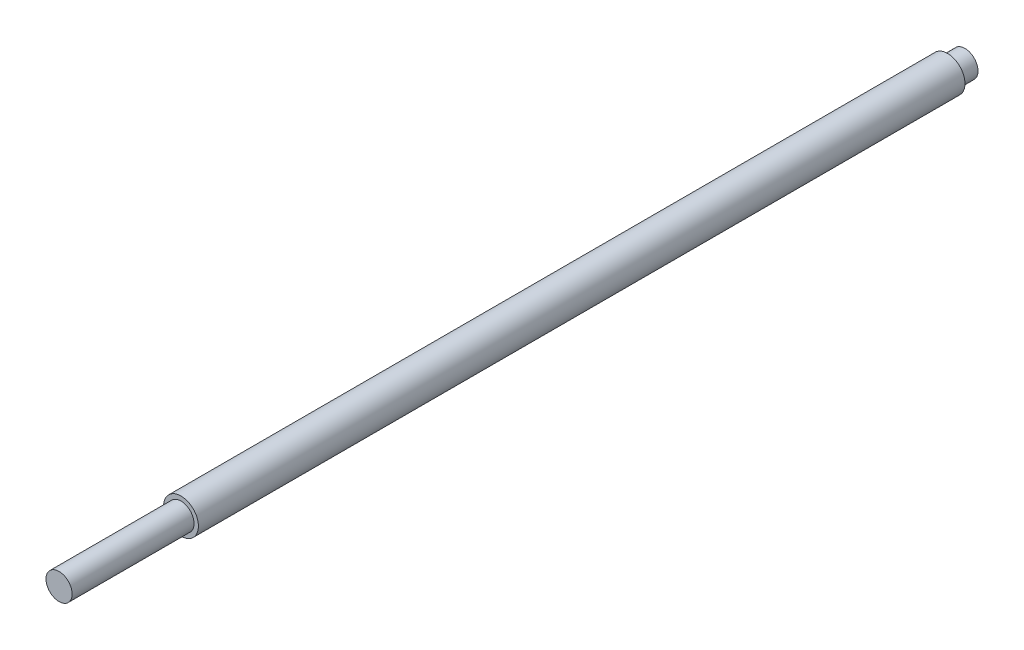
ISO-10303-21;
HEADER;
FILE_DESCRIPTION(('STEP AP214'),'2;1');
FILE_NAME('part.step','',(''),(''),'','','');
FILE_SCHEMA(('AUTOMOTIVE_DESIGN { 1 0 10303 214 1 1 1 1 }'));
ENDSEC;
DATA;
#1=APPLICATION_CONTEXT('core data for automotive mechanical design processes');
#2=APPLICATION_PROTOCOL_DEFINITION('international standard','automotive_design',2000,#1);
#3=PRODUCT_CONTEXT('',#1,'mechanical');
#4=PRODUCT('Part','Part','',(#3));
#5=PRODUCT_RELATED_PRODUCT_CATEGORY('part','',(#4));
#6=PRODUCT_DEFINITION_FORMATION('','',#4);
#7=PRODUCT_DEFINITION_CONTEXT('part definition',#1,'design');
#8=PRODUCT_DEFINITION('design','',#6,#7);
#9=PRODUCT_DEFINITION_SHAPE('','',#8);
#10=(LENGTH_UNIT() NAMED_UNIT(*) SI_UNIT(.MILLI.,.METRE.));
#11=(NAMED_UNIT(*) PLANE_ANGLE_UNIT() SI_UNIT($,.RADIAN.));
#12=(NAMED_UNIT(*) SI_UNIT($,.STERADIAN.) SOLID_ANGLE_UNIT());
#13=UNCERTAINTY_MEASURE_WITH_UNIT(LENGTH_MEASURE(1.E-05),#10,'distance_accuracy_value','');
#14=(GEOMETRIC_REPRESENTATION_CONTEXT(3) GLOBAL_UNCERTAINTY_ASSIGNED_CONTEXT((#13)) GLOBAL_UNIT_ASSIGNED_CONTEXT((#10,
#11,#12)) REPRESENTATION_CONTEXT('',''));
#15=CARTESIAN_POINT('',(0.,0.,0.));
#16=DIRECTION('',(0.,0.,1.));
#17=DIRECTION('',(1.,0.,0.));
#18=AXIS2_PLACEMENT_3D('',#15,#16,#17);
#19=CARTESIAN_POINT('',(0.,0.,330.2));
#20=DIRECTION('',(0.,0.,-1.));
#21=DIRECTION('',(-1.,0.,0.));
#22=AXIS2_PLACEMENT_3D('',#19,#20,#21);
#23=CYLINDRICAL_SURFACE('',#22,6.35);
#24=CARTESIAN_POINT('',(0.,0.,285.75));
#25=DIRECTION('',(0.,0.,1.));
#26=DIRECTION('',(1.,0.,0.));
#27=AXIS2_PLACEMENT_3D('',#24,#25,#26);
#28=CIRCLE('',#27,6.35);
#29=CARTESIAN_POINT('',(6.35,0.,285.75));
#30=VERTEX_POINT('',#29);
#31=EDGE_CURVE('E10',#30,#30,#28,.T.);
#32=ORIENTED_EDGE('',*,*,#31,.F.);
#33=EDGE_LOOP('',(#32));
#34=FACE_BOUND('',#33,.T.);
#35=CARTESIAN_POINT('',(0.,0.,6.35));
#36=DIRECTION('',(0.,0.,-1.));
#37=DIRECTION('',(-1.,0.,0.));
#38=AXIS2_PLACEMENT_3D('',#35,#36,#37);
#39=CIRCLE('',#38,6.35);
#40=CARTESIAN_POINT('',(-6.35,0.,6.35));
#41=VERTEX_POINT('',#40);
#42=EDGE_CURVE('E48',#41,#41,#39,.T.);
#43=ORIENTED_EDGE('',*,*,#42,.F.);
#44=EDGE_LOOP('',(#43));
#45=FACE_BOUND('',#44,.T.);
#46=ADVANCED_FACE('F33',(#34,#45),#23,.T.);
#47=CARTESIAN_POINT('',(0.,0.,285.75));
#48=DIRECTION('',(0.,0.,1.));
#49=DIRECTION('',(1.,0.,0.));
#50=AXIS2_PLACEMENT_3D('',#47,#48,#49);
#51=PLANE('',#50);
#52=CARTESIAN_POINT('',(0.,0.,285.75));
#53=DIRECTION('',(0.,0.,1.));
#54=DIRECTION('',(1.,0.,0.));
#55=AXIS2_PLACEMENT_3D('',#52,#53,#54);
#56=CIRCLE('',#55,4.7625);
#57=CARTESIAN_POINT('',(4.7625,0.,285.75));
#58=VERTEX_POINT('',#57);
#59=EDGE_CURVE('E39',#58,#58,#56,.T.);
#60=ORIENTED_EDGE('',*,*,#59,.F.);
#61=EDGE_LOOP('',(#60));
#62=FACE_BOUND('',#61,.T.);
#63=ORIENTED_EDGE('',*,*,#31,.T.);
#64=EDGE_LOOP('',(#63));
#65=FACE_BOUND('',#64,.T.);
#66=ADVANCED_FACE('F70',(#62,#65),#51,.T.);
#67=CARTESIAN_POINT('',(0.,0.,285.75));
#68=DIRECTION('',(0.,0.,1.));
#69=DIRECTION('',(1.,0.,0.));
#70=AXIS2_PLACEMENT_3D('',#67,#68,#69);
#71=CYLINDRICAL_SURFACE('',#70,4.7625);
#72=ORIENTED_EDGE('',*,*,#59,.T.);
#73=EDGE_LOOP('',(#72));
#74=FACE_BOUND('',#73,.T.);
#75=CARTESIAN_POINT('',(0.,0.,330.2));
#76=DIRECTION('',(0.,0.,1.));
#77=DIRECTION('',(1.,0.,0.));
#78=AXIS2_PLACEMENT_3D('',#75,#76,#77);
#79=CIRCLE('',#78,4.7625);
#80=CARTESIAN_POINT('',(4.7625,0.,330.2));
#81=VERTEX_POINT('',#80);
#82=EDGE_CURVE('E43',#81,#81,#79,.T.);
#83=ORIENTED_EDGE('',*,*,#82,.F.);
#84=EDGE_LOOP('',(#83));
#85=FACE_BOUND('',#84,.T.);
#86=ADVANCED_FACE('F75',(#74,#85),#71,.T.);
#87=CARTESIAN_POINT('',(0.,0.,330.2));
#88=DIRECTION('',(0.,0.,1.));
#89=DIRECTION('',(1.,0.,0.));
#90=AXIS2_PLACEMENT_3D('',#87,#88,#89);
#91=PLANE('',#90);
#92=ORIENTED_EDGE('',*,*,#82,.T.);
#93=EDGE_LOOP('',(#92));
#94=FACE_BOUND('',#93,.T.);
#95=ADVANCED_FACE('F65',(#94),#91,.T.);
#96=CARTESIAN_POINT('',(0.,0.,6.35));
#97=DIRECTION('',(0.,0.,-1.));
#98=DIRECTION('',(-1.,0.,0.));
#99=AXIS2_PLACEMENT_3D('',#96,#97,#98);
#100=PLANE('',#99);
#101=CARTESIAN_POINT('',(0.,0.,6.35));
#102=DIRECTION('',(0.,0.,-1.));
#103=DIRECTION('',(-1.,0.,0.));
#104=AXIS2_PLACEMENT_3D('',#101,#102,#103);
#105=CIRCLE('',#104,4.7625);
#106=CARTESIAN_POINT('',(-4.7625,0.,6.35));
#107=VERTEX_POINT('',#106);
#108=EDGE_CURVE('E52',#107,#107,#105,.T.);
#109=ORIENTED_EDGE('',*,*,#108,.F.);
#110=EDGE_LOOP('',(#109));
#111=FACE_BOUND('',#110,.T.);
#112=ORIENTED_EDGE('',*,*,#42,.T.);
#113=EDGE_LOOP('',(#112));
#114=FACE_BOUND('',#113,.T.);
#115=ADVANCED_FACE('F62',(#111,#114),#100,.T.);
#116=CARTESIAN_POINT('',(0.,0.,6.35));
#117=DIRECTION('',(0.,0.,-1.));
#118=DIRECTION('',(-1.,0.,0.));
#119=AXIS2_PLACEMENT_3D('',#116,#117,#118);
#120=CYLINDRICAL_SURFACE('',#119,4.7625);
#121=ORIENTED_EDGE('',*,*,#108,.T.);
#122=EDGE_LOOP('',(#121));
#123=FACE_BOUND('',#122,.T.);
#124=CARTESIAN_POINT('',(0.,0.,0.));
#125=DIRECTION('',(0.,0.,-1.));
#126=DIRECTION('',(-1.,0.,0.));
#127=AXIS2_PLACEMENT_3D('',#124,#125,#126);
#128=CIRCLE('',#127,4.7625);
#129=CARTESIAN_POINT('',(-4.7625,0.,0.));
#130=VERTEX_POINT('',#129);
#131=EDGE_CURVE('E53',#130,#130,#128,.T.);
#132=ORIENTED_EDGE('',*,*,#131,.F.);
#133=EDGE_LOOP('',(#132));
#134=FACE_BOUND('',#133,.T.);
#135=ADVANCED_FACE('F59',(#123,#134),#120,.T.);
#136=CARTESIAN_POINT('',(0.,0.,0.));
#137=DIRECTION('',(0.,0.,1.));
#138=DIRECTION('',(1.,0.,0.));
#139=AXIS2_PLACEMENT_3D('',#136,#137,#138);
#140=PLANE('',#139);
#141=ORIENTED_EDGE('',*,*,#131,.T.);
#142=EDGE_LOOP('',(#141));
#143=FACE_BOUND('',#142,.T.);
#144=ADVANCED_FACE('F85',(#143),#140,.F.);
#145=CLOSED_SHELL('',(#46,#66,#86,#95,#115,#135,#144));
#146=MANIFOLD_SOLID_BREP('B2',#145);
#147=ADVANCED_BREP_SHAPE_REPRESENTATION('',(#18,#146),#14);
#148=SHAPE_DEFINITION_REPRESENTATION(#9,#147);
ENDSEC;
END-ISO-10303-21;
